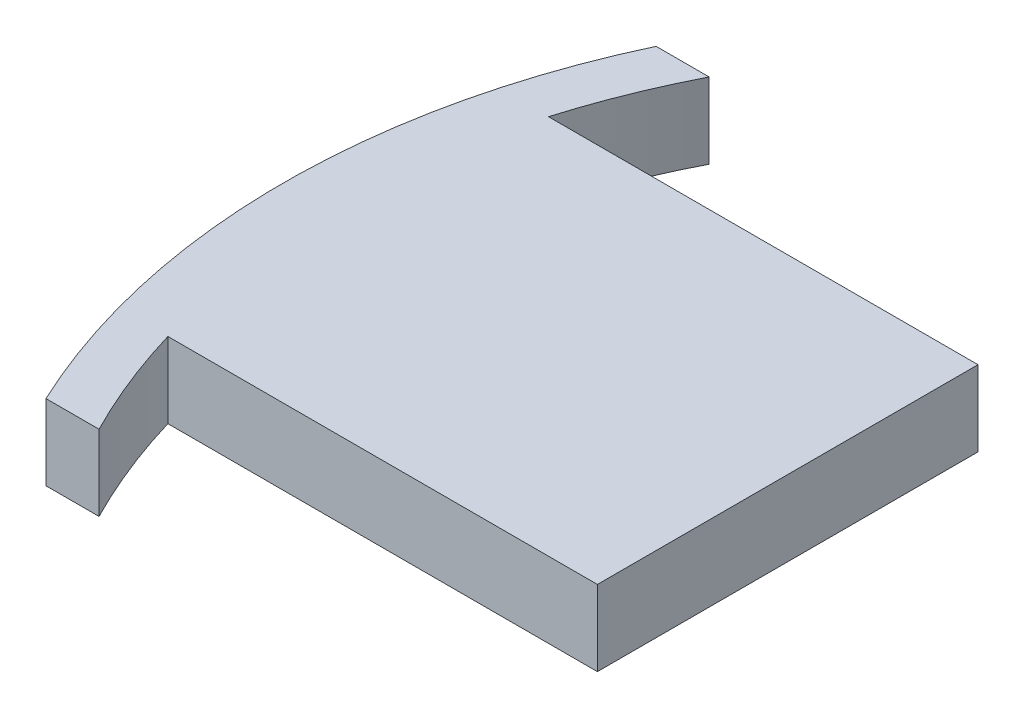
ISO-10303-21;
HEADER;
FILE_DESCRIPTION(('STEP AP214'),'2;1');
FILE_NAME('part.step','',(''),(''),'','','');
FILE_SCHEMA(('AUTOMOTIVE_DESIGN { 1 0 10303 214 1 1 1 1 }'));
ENDSEC;
DATA;
#1=APPLICATION_CONTEXT('core data for automotive mechanical design processes');
#2=APPLICATION_PROTOCOL_DEFINITION('international standard','automotive_design',2000,#1);
#3=PRODUCT_CONTEXT('',#1,'mechanical');
#4=PRODUCT('Part','Part','',(#3));
#5=PRODUCT_RELATED_PRODUCT_CATEGORY('part','',(#4));
#6=PRODUCT_DEFINITION_FORMATION('','',#4);
#7=PRODUCT_DEFINITION_CONTEXT('part definition',#1,'design');
#8=PRODUCT_DEFINITION('design','',#6,#7);
#9=PRODUCT_DEFINITION_SHAPE('','',#8);
#10=(LENGTH_UNIT() NAMED_UNIT(*) SI_UNIT(.MILLI.,.METRE.));
#11=(NAMED_UNIT(*) PLANE_ANGLE_UNIT() SI_UNIT($,.RADIAN.));
#12=(NAMED_UNIT(*) SI_UNIT($,.STERADIAN.) SOLID_ANGLE_UNIT());
#13=UNCERTAINTY_MEASURE_WITH_UNIT(LENGTH_MEASURE(1.E-05),#10,'distance_accuracy_value','');
#14=(GEOMETRIC_REPRESENTATION_CONTEXT(3) GLOBAL_UNCERTAINTY_ASSIGNED_CONTEXT((#13)) GLOBAL_UNIT_ASSIGNED_CONTEXT((#10,
#11,#12)) REPRESENTATION_CONTEXT('',''));
#15=CARTESIAN_POINT('',(0.,0.,0.));
#16=DIRECTION('',(0.,0.,1.));
#17=DIRECTION('',(1.,0.,0.));
#18=AXIS2_PLACEMENT_3D('',#15,#16,#17);
#19=CARTESIAN_POINT('',(0.,1.975,0.));
#20=DIRECTION('',(0.,-1.,0.));
#21=DIRECTION('',(0.,0.,-1.));
#22=AXIS2_PLACEMENT_3D('',#19,#20,#21);
#23=CYLINDRICAL_SURFACE('',#22,17.505);
#24=CARTESIAN_POINT('',(0.,0.,0.));
#25=DIRECTION('',(0.,1.,0.));
#26=DIRECTION('',(0.,0.,1.));
#27=AXIS2_PLACEMENT_3D('',#24,#25,#26);
#28=CIRCLE('',#27,17.505);
#29=CARTESIAN_POINT('',(-16.7831582248396,0.,4.975));
#30=VERTEX_POINT('',#29);
#31=CARTESIAN_POINT('',(-15.5828238775904,0.,7.975));
#32=VERTEX_POINT('',#31);
#33=EDGE_CURVE('E140',#30,#32,#28,.T.);
#34=ORIENTED_EDGE('',*,*,#33,.F.);
#35=DIRECTION('',(0.,-1.,0.));
#36=VECTOR('',#35,1.);
#37=CARTESIAN_POINT('',(-16.7831582248396,1.975,4.975));
#38=LINE('',#37,#36);
#39=CARTESIAN_POINT('',(-16.7831582248396,1.975,4.975));
#40=VERTEX_POINT('',#39);
#41=EDGE_CURVE('E11',#40,#30,#38,.T.);
#42=ORIENTED_EDGE('',*,*,#41,.F.);
#43=CARTESIAN_POINT('',(0.,1.975,0.));
#44=DIRECTION('',(0.,1.,0.));
#45=DIRECTION('',(0.,0.,1.));
#46=AXIS2_PLACEMENT_3D('',#43,#44,#45);
#47=CIRCLE('',#46,17.505);
#48=CARTESIAN_POINT('',(-15.5828238775904,1.975,7.975));
#49=VERTEX_POINT('',#48);
#50=EDGE_CURVE('E168',#40,#49,#47,.T.);
#51=ORIENTED_EDGE('',*,*,#50,.T.);
#52=DIRECTION('',(0.,-1.,0.));
#53=VECTOR('',#52,1.);
#54=CARTESIAN_POINT('',(-15.5828238775904,1.975,7.975));
#55=LINE('',#54,#53);
#56=EDGE_CURVE('E56',#49,#32,#55,.T.);
#57=ORIENTED_EDGE('',*,*,#56,.T.);
#58=EDGE_LOOP('',(#34,#42,#51,#57));
#59=FACE_BOUND('',#58,.T.);
#60=ADVANCED_FACE('F39',(#59),#23,.F.);
#61=CARTESIAN_POINT('',(0.,1.975,4.975));
#62=DIRECTION('',(0.,0.,1.));
#63=DIRECTION('',(1.,0.,0.));
#64=AXIS2_PLACEMENT_3D('',#61,#62,#63);
#65=PLANE('',#64);
#66=DIRECTION('',(-1.,0.,0.));
#67=VECTOR('',#66,1.);
#68=CARTESIAN_POINT('',(0.,0.,4.975));
#69=LINE('',#68,#67);
#70=CARTESIAN_POINT('',(-5.555,0.,4.975));
#71=VERTEX_POINT('',#70);
#72=EDGE_CURVE('E143',#71,#30,#69,.T.);
#73=ORIENTED_EDGE('',*,*,#72,.F.);
#74=DIRECTION('',(0.,-1.,0.));
#75=VECTOR('',#74,1.);
#76=CARTESIAN_POINT('',(-5.555,1.975,4.975));
#77=LINE('',#76,#75);
#78=CARTESIAN_POINT('',(-5.555,1.975,4.975));
#79=VERTEX_POINT('',#78);
#80=EDGE_CURVE('E48',#79,#71,#77,.T.);
#81=ORIENTED_EDGE('',*,*,#80,.F.);
#82=DIRECTION('',(-1.,0.,0.));
#83=VECTOR('',#82,1.);
#84=CARTESIAN_POINT('',(0.,1.975,4.975));
#85=LINE('',#84,#83);
#86=EDGE_CURVE('E199',#79,#40,#85,.T.);
#87=ORIENTED_EDGE('',*,*,#86,.T.);
#88=ORIENTED_EDGE('',*,*,#41,.T.);
#89=EDGE_LOOP('',(#73,#81,#87,#88));
#90=FACE_BOUND('',#89,.T.);
#91=ADVANCED_FACE('F191',(#90),#65,.T.);
#92=CARTESIAN_POINT('',(-5.555,1.975,0.));
#93=DIRECTION('',(1.,0.,0.));
#94=DIRECTION('',(0.,0.,-1.));
#95=AXIS2_PLACEMENT_3D('',#92,#93,#94);
#96=PLANE('',#95);
#97=DIRECTION('',(0.,0.,1.));
#98=VECTOR('',#97,1.);
#99=CARTESIAN_POINT('',(-5.555,0.,0.));
#100=LINE('',#99,#98);
#101=CARTESIAN_POINT('',(-5.555,0.,-4.975));
#102=VERTEX_POINT('',#101);
#103=EDGE_CURVE('E147',#102,#71,#100,.T.);
#104=ORIENTED_EDGE('',*,*,#103,.F.);
#105=DIRECTION('',(0.,-1.,0.));
#106=VECTOR('',#105,1.);
#107=CARTESIAN_POINT('',(-5.555,1.975,-4.975));
#108=LINE('',#107,#106);
#109=CARTESIAN_POINT('',(-5.555,1.975,-4.975));
#110=VERTEX_POINT('',#109);
#111=EDGE_CURVE('E178',#110,#102,#108,.T.);
#112=ORIENTED_EDGE('',*,*,#111,.F.);
#113=DIRECTION('',(0.,0.,1.));
#114=VECTOR('',#113,1.);
#115=CARTESIAN_POINT('',(-5.555,1.975,0.));
#116=LINE('',#115,#114);
#117=EDGE_CURVE('E187',#110,#79,#116,.T.);
#118=ORIENTED_EDGE('',*,*,#117,.T.);
#119=ORIENTED_EDGE('',*,*,#80,.T.);
#120=EDGE_LOOP('',(#104,#112,#118,#119));
#121=FACE_BOUND('',#120,.T.);
#122=ADVANCED_FACE('F185',(#121),#96,.T.);
#123=CARTESIAN_POINT('',(0.,1.975,-4.975));
#124=DIRECTION('',(0.,0.,-1.));
#125=DIRECTION('',(-1.,0.,0.));
#126=AXIS2_PLACEMENT_3D('',#123,#124,#125);
#127=PLANE('',#126);
#128=DIRECTION('',(1.,0.,0.));
#129=VECTOR('',#128,1.);
#130=CARTESIAN_POINT('',(0.,0.,-4.975));
#131=LINE('',#130,#129);
#132=CARTESIAN_POINT('',(-16.7831582248396,0.,-4.975));
#133=VERTEX_POINT('',#132);
#134=EDGE_CURVE('E151',#133,#102,#131,.T.);
#135=ORIENTED_EDGE('',*,*,#134,.F.);
#136=DIRECTION('',(0.,-1.,0.));
#137=VECTOR('',#136,1.);
#138=CARTESIAN_POINT('',(-16.7831582248396,1.975,-4.975));
#139=LINE('',#138,#137);
#140=CARTESIAN_POINT('',(-16.7831582248396,1.975,-4.975));
#141=VERTEX_POINT('',#140);
#142=EDGE_CURVE('E175',#141,#133,#139,.T.);
#143=ORIENTED_EDGE('',*,*,#142,.F.);
#144=DIRECTION('',(1.,0.,0.));
#145=VECTOR('',#144,1.);
#146=CARTESIAN_POINT('',(0.,1.975,-4.975));
#147=LINE('',#146,#145);
#148=EDGE_CURVE('E134',#141,#110,#147,.T.);
#149=ORIENTED_EDGE('',*,*,#148,.T.);
#150=ORIENTED_EDGE('',*,*,#111,.T.);
#151=EDGE_LOOP('',(#135,#143,#149,#150));
#152=FACE_BOUND('',#151,.T.);
#153=ADVANCED_FACE('F197',(#152),#127,.T.);
#154=CARTESIAN_POINT('',(0.,1.975,0.));
#155=DIRECTION('',(0.,-1.,0.));
#156=DIRECTION('',(0.,0.,-1.));
#157=AXIS2_PLACEMENT_3D('',#154,#155,#156);
#158=CYLINDRICAL_SURFACE('',#157,17.505);
#159=CARTESIAN_POINT('',(0.,0.,0.));
#160=DIRECTION('',(0.,1.,0.));
#161=DIRECTION('',(0.,0.,1.));
#162=AXIS2_PLACEMENT_3D('',#159,#160,#161);
#163=CIRCLE('',#162,17.505);
#164=CARTESIAN_POINT('',(-15.5828238775904,0.,-7.975));
#165=VERTEX_POINT('',#164);
#166=EDGE_CURVE('E155',#165,#133,#163,.T.);
#167=ORIENTED_EDGE('',*,*,#166,.F.);
#168=DIRECTION('',(0.,-1.,0.));
#169=VECTOR('',#168,1.);
#170=CARTESIAN_POINT('',(-15.5828238775904,1.975,-7.975));
#171=LINE('',#170,#169);
#172=CARTESIAN_POINT('',(-15.5828238775904,1.975,-7.975));
#173=VERTEX_POINT('',#172);
#174=EDGE_CURVE('E117',#173,#165,#171,.T.);
#175=ORIENTED_EDGE('',*,*,#174,.F.);
#176=CARTESIAN_POINT('',(0.,1.975,0.));
#177=DIRECTION('',(0.,1.,0.));
#178=DIRECTION('',(0.,0.,1.));
#179=AXIS2_PLACEMENT_3D('',#176,#177,#178);
#180=CIRCLE('',#179,17.505);
#181=EDGE_CURVE('E130',#173,#141,#180,.T.);
#182=ORIENTED_EDGE('',*,*,#181,.T.);
#183=ORIENTED_EDGE('',*,*,#142,.T.);
#184=EDGE_LOOP('',(#167,#175,#182,#183));
#185=FACE_BOUND('',#184,.T.);
#186=ADVANCED_FACE('F228',(#185),#158,.F.);
#187=CARTESIAN_POINT('',(0.,1.975,-7.975));
#188=DIRECTION('',(0.,0.,-1.));
#189=DIRECTION('',(-1.,0.,0.));
#190=AXIS2_PLACEMENT_3D('',#187,#188,#189);
#191=PLANE('',#190);
#192=DIRECTION('',(1.,0.,0.));
#193=VECTOR('',#192,1.);
#194=CARTESIAN_POINT('',(0.,0.,-7.975));
#195=LINE('',#194,#193);
#196=CARTESIAN_POINT('',(-16.9694394427158,0.,-7.975));
#197=VERTEX_POINT('',#196);
#198=EDGE_CURVE('E113',#197,#165,#195,.T.);
#199=ORIENTED_EDGE('',*,*,#198,.F.);
#200=DIRECTION('',(0.,-1.,0.));
#201=VECTOR('',#200,1.);
#202=CARTESIAN_POINT('',(-16.9694394427158,1.975,-7.975));
#203=LINE('',#202,#201);
#204=CARTESIAN_POINT('',(-16.9694394427158,1.975,-7.975));
#205=VERTEX_POINT('',#204);
#206=EDGE_CURVE('E107',#205,#197,#203,.T.);
#207=ORIENTED_EDGE('',*,*,#206,.F.);
#208=DIRECTION('',(1.,0.,0.));
#209=VECTOR('',#208,1.);
#210=CARTESIAN_POINT('',(0.,1.975,-7.975));
#211=LINE('',#210,#209);
#212=EDGE_CURVE('E111',#205,#173,#211,.T.);
#213=ORIENTED_EDGE('',*,*,#212,.T.);
#214=ORIENTED_EDGE('',*,*,#174,.T.);
#215=EDGE_LOOP('',(#199,#207,#213,#214));
#216=FACE_BOUND('',#215,.T.);
#217=ADVANCED_FACE('F109',(#216),#191,.T.);
#218=CARTESIAN_POINT('',(0.,1.975,0.));
#219=DIRECTION('',(0.,-1.,0.));
#220=DIRECTION('',(0.,0.,-1.));
#221=AXIS2_PLACEMENT_3D('',#218,#219,#220);
#222=CYLINDRICAL_SURFACE('',#221,18.75);
#223=CARTESIAN_POINT('',(0.,0.,0.));
#224=DIRECTION('',(0.,1.,0.));
#225=DIRECTION('',(0.,0.,1.));
#226=AXIS2_PLACEMENT_3D('',#223,#224,#225);
#227=CIRCLE('',#226,18.75);
#228=CARTESIAN_POINT('',(-16.9694394427158,0.,7.975));
#229=VERTEX_POINT('',#228);
#230=EDGE_CURVE('E161',#197,#229,#227,.T.);
#231=ORIENTED_EDGE('',*,*,#230,.T.);
#232=DIRECTION('',(0.,-1.,0.));
#233=VECTOR('',#232,1.);
#234=CARTESIAN_POINT('',(-16.9694394427158,1.975,7.975));
#235=LINE('',#234,#233);
#236=CARTESIAN_POINT('',(-16.9694394427158,1.975,7.975));
#237=VERTEX_POINT('',#236);
#238=EDGE_CURVE('E82',#237,#229,#235,.T.);
#239=ORIENTED_EDGE('',*,*,#238,.F.);
#240=CARTESIAN_POINT('',(0.,1.975,0.));
#241=DIRECTION('',(0.,1.,0.));
#242=DIRECTION('',(0.,0.,1.));
#243=AXIS2_PLACEMENT_3D('',#240,#241,#242);
#244=CIRCLE('',#243,18.75);
#245=EDGE_CURVE('E119',#205,#237,#244,.T.);
#246=ORIENTED_EDGE('',*,*,#245,.F.);
#247=ORIENTED_EDGE('',*,*,#206,.T.);
#248=EDGE_LOOP('',(#231,#239,#246,#247));
#249=FACE_BOUND('',#248,.T.);
#250=ADVANCED_FACE('F120',(#249),#222,.T.);
#251=CARTESIAN_POINT('',(0.,1.975,7.975));
#252=DIRECTION('',(0.,0.,1.));
#253=DIRECTION('',(1.,0.,0.));
#254=AXIS2_PLACEMENT_3D('',#251,#252,#253);
#255=PLANE('',#254);
#256=DIRECTION('',(-1.,0.,0.));
#257=VECTOR('',#256,1.);
#258=CARTESIAN_POINT('',(0.,0.,7.975));
#259=LINE('',#258,#257);
#260=EDGE_CURVE('E164',#32,#229,#259,.T.);
#261=ORIENTED_EDGE('',*,*,#260,.F.);
#262=ORIENTED_EDGE('',*,*,#56,.F.);
#263=DIRECTION('',(-1.,0.,0.));
#264=VECTOR('',#263,1.);
#265=CARTESIAN_POINT('',(0.,1.975,7.975));
#266=LINE('',#265,#264);
#267=EDGE_CURVE('E124',#49,#237,#266,.T.);
#268=ORIENTED_EDGE('',*,*,#267,.T.);
#269=ORIENTED_EDGE('',*,*,#238,.T.);
#270=EDGE_LOOP('',(#261,#262,#268,#269));
#271=FACE_BOUND('',#270,.T.);
#272=ADVANCED_FACE('F207',(#271),#255,.T.);
#273=CARTESIAN_POINT('',(0.,1.975,0.));
#274=DIRECTION('',(0.,1.,0.));
#275=DIRECTION('',(0.,0.,1.));
#276=AXIS2_PLACEMENT_3D('',#273,#274,#275);
#277=PLANE('',#276);
#278=ORIENTED_EDGE('',*,*,#50,.F.);
#279=ORIENTED_EDGE('',*,*,#86,.F.);
#280=ORIENTED_EDGE('',*,*,#117,.F.);
#281=ORIENTED_EDGE('',*,*,#148,.F.);
#282=ORIENTED_EDGE('',*,*,#181,.F.);
#283=ORIENTED_EDGE('',*,*,#212,.F.);
#284=ORIENTED_EDGE('',*,*,#245,.T.);
#285=ORIENTED_EDGE('',*,*,#267,.F.);
#286=EDGE_LOOP('',(#278,#279,#280,#281,#282,#283,#284,#285));
#287=FACE_BOUND('',#286,.T.);
#288=ADVANCED_FACE('F127',(#287),#277,.T.);
#289=CARTESIAN_POINT('',(0.,0.,0.));
#290=DIRECTION('',(0.,1.,0.));
#291=DIRECTION('',(0.,0.,1.));
#292=AXIS2_PLACEMENT_3D('',#289,#290,#291);
#293=PLANE('',#292);
#294=ORIENTED_EDGE('',*,*,#33,.T.);
#295=ORIENTED_EDGE('',*,*,#260,.T.);
#296=ORIENTED_EDGE('',*,*,#230,.F.);
#297=ORIENTED_EDGE('',*,*,#198,.T.);
#298=ORIENTED_EDGE('',*,*,#166,.T.);
#299=ORIENTED_EDGE('',*,*,#134,.T.);
#300=ORIENTED_EDGE('',*,*,#103,.T.);
#301=ORIENTED_EDGE('',*,*,#72,.T.);
#302=EDGE_LOOP('',(#294,#295,#296,#297,#298,#299,#300,#301));
#303=FACE_BOUND('',#302,.T.);
#304=ADVANCED_FACE('F193',(#303),#293,.F.);
#305=CLOSED_SHELL('',(#60,#91,#122,#153,#186,#217,#250,#272,#288,#304));
#306=MANIFOLD_SOLID_BREP('B2',#305);
#307=ADVANCED_BREP_SHAPE_REPRESENTATION('',(#18,#306),#14);
#308=SHAPE_DEFINITION_REPRESENTATION(#9,#307);
ENDSEC;
END-ISO-10303-21;
